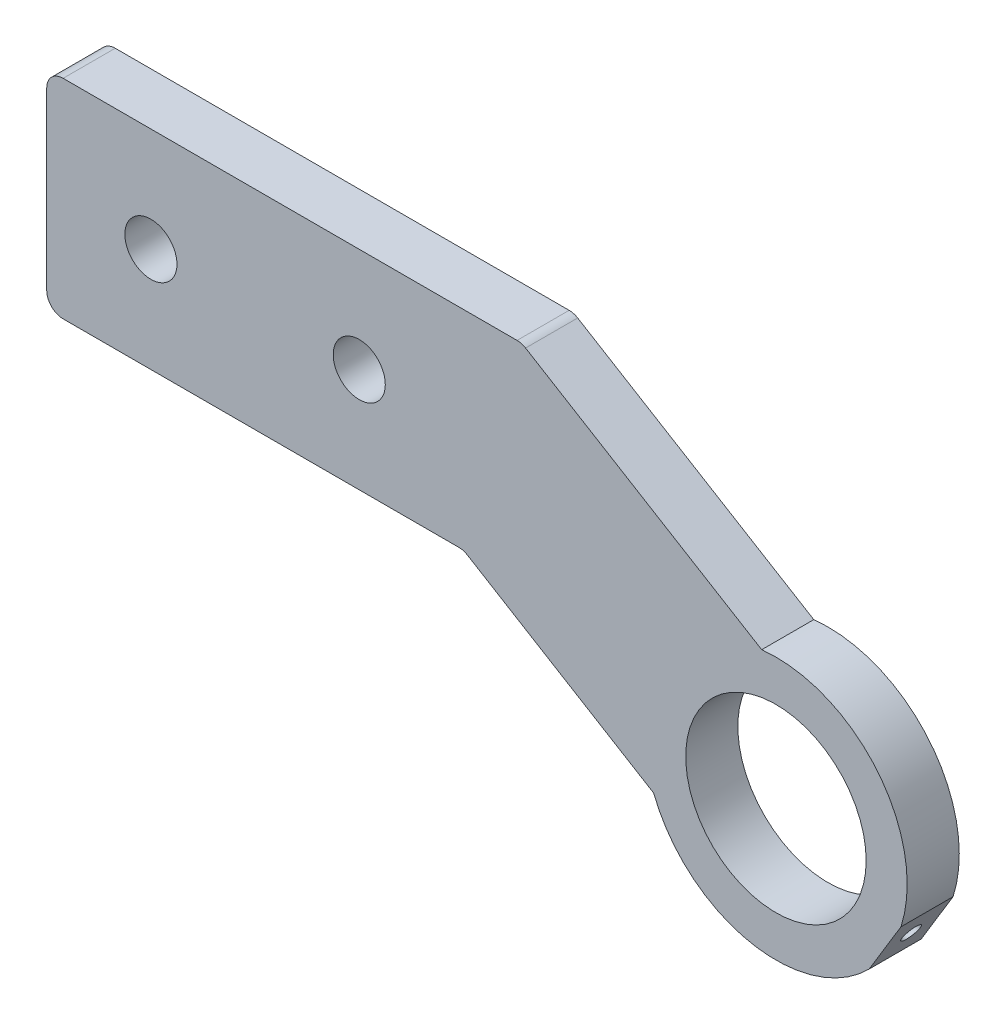
ISO-10303-21;
HEADER;
FILE_DESCRIPTION(('STEP AP214'),'2;1');
FILE_NAME('part.step','',(''),(''),'','','');
FILE_SCHEMA(('AUTOMOTIVE_DESIGN { 1 0 10303 214 1 1 1 1 }'));
ENDSEC;
DATA;
#1=APPLICATION_CONTEXT('core data for automotive mechanical design processes');
#2=APPLICATION_PROTOCOL_DEFINITION('international standard','automotive_design',2000,#1);
#3=PRODUCT_CONTEXT('',#1,'mechanical');
#4=PRODUCT('Part','Part','',(#3));
#5=PRODUCT_RELATED_PRODUCT_CATEGORY('part','',(#4));
#6=PRODUCT_DEFINITION_FORMATION('','',#4);
#7=PRODUCT_DEFINITION_CONTEXT('part definition',#1,'design');
#8=PRODUCT_DEFINITION('design','',#6,#7);
#9=PRODUCT_DEFINITION_SHAPE('','',#8);
#10=(LENGTH_UNIT() NAMED_UNIT(*) SI_UNIT(.MILLI.,.METRE.));
#11=(NAMED_UNIT(*) PLANE_ANGLE_UNIT() SI_UNIT($,.RADIAN.));
#12=(NAMED_UNIT(*) SI_UNIT($,.STERADIAN.) SOLID_ANGLE_UNIT());
#13=UNCERTAINTY_MEASURE_WITH_UNIT(LENGTH_MEASURE(1.E-05),#10,'distance_accuracy_value','');
#14=(GEOMETRIC_REPRESENTATION_CONTEXT(3) GLOBAL_UNCERTAINTY_ASSIGNED_CONTEXT((#13)) GLOBAL_UNIT_ASSIGNED_CONTEXT((#10,
#11,#12)) REPRESENTATION_CONTEXT('',''));
#15=CARTESIAN_POINT('',(0.,0.,0.));
#16=DIRECTION('',(0.,0.,1.));
#17=DIRECTION('',(1.,0.,0.));
#18=AXIS2_PLACEMENT_3D('',#15,#16,#17);
#19=CARTESIAN_POINT('',(50.8,-20.95,6.35));
#20=DIRECTION('',(0.,0.,-1.));
#21=DIRECTION('',(-1.,0.,0.));
#22=AXIS2_PLACEMENT_3D('',#19,#20,#21);
#23=PLANE('',#22);
#24=DIRECTION('',(-0.855084093292463,0.518489337786426,0.));
#25=VECTOR('',#24,1.);
#26=CARTESIAN_POINT('',(19.7992087244958,12.7,6.35));
#27=LINE('',#26,#25);
#28=CARTESIAN_POINT('',(49.0632163255362,-5.04454236847881,6.35));
#29=VERTEX_POINT('',#28);
#30=CARTESIAN_POINT('',(20.2771945871162,12.4101681865849,6.35));
#31=VERTEX_POINT('',#30);
#32=EDGE_CURVE('E155',#29,#31,#27,.T.);
#33=ORIENTED_EDGE('',*,*,#32,.T.);
#34=CARTESIAN_POINT('',(19.2402159115434,10.7,6.35));
#35=DIRECTION('',(0.,0.,-1.));
#36=DIRECTION('',(-1.,0.,0.));
#37=AXIS2_PLACEMENT_3D('',#34,#35,#36);
#38=CIRCLE('',#37,2.);
#39=CARTESIAN_POINT('',(19.2402159115434,12.7,6.35));
#40=VERTEX_POINT('',#39);
#41=EDGE_CURVE('E202',#31,#40,#38,.F.);
#42=ORIENTED_EDGE('',*,*,#41,.T.);
#43=DIRECTION('',(-1.,0.,0.));
#44=VECTOR('',#43,1.);
#45=CARTESIAN_POINT('',(19.7992087244958,12.7,6.35));
#46=LINE('',#45,#44);
#47=CARTESIAN_POINT('',(-36.1,12.7,6.35));
#48=VERTEX_POINT('',#47);
#49=EDGE_CURVE('E157',#40,#48,#46,.T.);
#50=ORIENTED_EDGE('',*,*,#49,.T.);
#51=CARTESIAN_POINT('',(-36.1,10.7,6.35));
#52=DIRECTION('',(0.,0.,-1.));
#53=DIRECTION('',(-1.,0.,0.));
#54=AXIS2_PLACEMENT_3D('',#51,#52,#53);
#55=CIRCLE('',#54,2.);
#56=CARTESIAN_POINT('',(-38.1,10.7,6.35));
#57=VERTEX_POINT('',#56);
#58=EDGE_CURVE('E55',#48,#57,#55,.F.);
#59=ORIENTED_EDGE('',*,*,#58,.T.);
#60=DIRECTION('',(0.,-1.,0.));
#61=VECTOR('',#60,1.);
#62=CARTESIAN_POINT('',(-38.1,-12.7,6.35));
#63=LINE('',#62,#61);
#64=CARTESIAN_POINT('',(-38.1,-10.7,6.35));
#65=VERTEX_POINT('',#64);
#66=EDGE_CURVE('E159',#57,#65,#63,.T.);
#67=ORIENTED_EDGE('',*,*,#66,.T.);
#68=CARTESIAN_POINT('',(-36.1,-10.7,6.35));
#69=DIRECTION('',(0.,0.,-1.));
#70=DIRECTION('',(-1.,0.,0.));
#71=AXIS2_PLACEMENT_3D('',#68,#69,#70);
#72=CIRCLE('',#71,2.);
#73=CARTESIAN_POINT('',(-36.1,-12.7,6.35));
#74=VERTEX_POINT('',#73);
#75=EDGE_CURVE('E200',#65,#74,#72,.F.);
#76=ORIENTED_EDGE('',*,*,#75,.T.);
#77=DIRECTION('',(1.,0.,0.));
#78=VECTOR('',#77,1.);
#79=CARTESIAN_POINT('',(12.7,-12.7,6.35));
#80=LINE('',#79,#78);
#81=CARTESIAN_POINT('',(12.1410071870476,-12.7,6.35));
#82=VERTEX_POINT('',#81);
#83=EDGE_CURVE('E133',#74,#82,#80,.T.);
#84=ORIENTED_EDGE('',*,*,#83,.T.);
#85=CARTESIAN_POINT('',(12.1410071870476,-14.7,6.35));
#86=DIRECTION('',(0.,0.,-1.));
#87=DIRECTION('',(-1.,0.,0.));
#88=AXIS2_PLACEMENT_3D('',#85,#86,#87);
#89=CIRCLE('',#88,2.);
#90=CARTESIAN_POINT('',(13.1779858626204,-12.9898318134151,6.35));
#91=VERTEX_POINT('',#90);
#92=EDGE_CURVE('E11',#82,#91,#89,.T.);
#93=ORIENTED_EDGE('',*,*,#92,.T.);
#94=DIRECTION('',(0.855084093292463,-0.518489337786426,0.));
#95=VECTOR('',#94,1.);
#96=CARTESIAN_POINT('',(12.7,-12.7,6.35));
#97=LINE('',#96,#95);
#98=CARTESIAN_POINT('',(35.893587145761,-26.7636783381074,6.35));
#99=VERTEX_POINT('',#98);
#100=EDGE_CURVE('E121',#91,#99,#97,.T.);
#101=ORIENTED_EDGE('',*,*,#100,.T.);
#102=CARTESIAN_POINT('',(50.8,-20.95,6.35));
#103=DIRECTION('',(0.,0.,1.));
#104=DIRECTION('',(-1.,0.,0.));
#105=AXIS2_PLACEMENT_3D('',#102,#103,#104);
#106=CIRCLE('',#105,16.);
#107=CARTESIAN_POINT('',(62.1559338958914,-32.2213249155609,6.35));
#108=VERTEX_POINT('',#107);
#109=EDGE_CURVE('E126',#99,#108,#106,.T.);
#110=ORIENTED_EDGE('',*,*,#109,.T.);
#111=DIRECTION('',(0.518489337786426,0.855084093292463,0.));
#112=VECTOR('',#111,1.);
#113=CARTESIAN_POINT('',(66.0446039292896,-25.8081942158675,6.35));
#114=LINE('',#113,#112);
#115=CARTESIAN_POINT('',(66.0446039292896,-25.8081942158675,6.35));
#116=VERTEX_POINT('',#115);
#117=EDGE_CURVE('E148',#108,#116,#114,.T.);
#118=ORIENTED_EDGE('',*,*,#117,.T.);
#119=CARTESIAN_POINT('',(50.8,-20.95,6.35));
#120=DIRECTION('',(0.,0.,1.));
#121=DIRECTION('',(-1.,0.,0.));
#122=AXIS2_PLACEMENT_3D('',#119,#120,#121);
#123=CIRCLE('',#122,16.);
#124=EDGE_CURVE('E150',#116,#29,#123,.T.);
#125=ORIENTED_EDGE('',*,*,#124,.T.);
#126=EDGE_LOOP('',(#33,#42,#50,#59,#67,#76,#84,#93,#101,#110,#118,#125));
#127=FACE_BOUND('',#126,.T.);
#128=CARTESIAN_POINT('',(50.8,-20.95,6.35));
#129=DIRECTION('',(0.,0.,1.));
#130=DIRECTION('',(1.,0.,0.));
#131=AXIS2_PLACEMENT_3D('',#128,#129,#130);
#132=CIRCLE('',#131,11.);
#133=CARTESIAN_POINT('',(61.8,-20.95,6.35));
#134=VERTEX_POINT('',#133);
#135=EDGE_CURVE('E165',#134,#134,#132,.T.);
#136=ORIENTED_EDGE('',*,*,#135,.F.);
#137=EDGE_LOOP('',(#136));
#138=FACE_BOUND('',#137,.T.);
#139=CARTESIAN_POINT('',(-25.4,0.,6.35));
#140=DIRECTION('',(0.,0.,1.));
#141=DIRECTION('',(1.,0.,0.));
#142=AXIS2_PLACEMENT_3D('',#139,#140,#141);
#143=CIRCLE('',#142,3.175);
#144=CARTESIAN_POINT('',(-22.225,0.,6.35));
#145=VERTEX_POINT('',#144);
#146=EDGE_CURVE('E382',#145,#145,#143,.T.);
#147=ORIENTED_EDGE('',*,*,#146,.F.);
#148=EDGE_LOOP('',(#147));
#149=FACE_BOUND('',#148,.T.);
#150=CARTESIAN_POINT('',(0.,0.,6.35));
#151=DIRECTION('',(0.,0.,1.));
#152=DIRECTION('',(1.,0.,0.));
#153=AXIS2_PLACEMENT_3D('',#150,#151,#152);
#154=CIRCLE('',#153,3.175);
#155=CARTESIAN_POINT('',(3.175,0.,6.35));
#156=VERTEX_POINT('',#155);
#157=EDGE_CURVE('E375',#156,#156,#154,.T.);
#158=ORIENTED_EDGE('',*,*,#157,.F.);
#159=EDGE_LOOP('',(#158));
#160=FACE_BOUND('',#159,.T.);
#161=ADVANCED_FACE('F33',(#127,#138,#149,#160),#23,.F.);
#162=CARTESIAN_POINT('',(50.8,-20.95,0.));
#163=DIRECTION('',(0.,0.,-1.));
#164=DIRECTION('',(-1.,0.,0.));
#165=AXIS2_PLACEMENT_3D('',#162,#163,#164);
#166=PLANE('',#165);
#167=CARTESIAN_POINT('',(-25.4,0.,0.));
#168=DIRECTION('',(0.,0.,1.));
#169=DIRECTION('',(1.,0.,0.));
#170=AXIS2_PLACEMENT_3D('',#167,#168,#169);
#171=CIRCLE('',#170,3.175);
#172=CARTESIAN_POINT('',(-22.225,0.,0.));
#173=VERTEX_POINT('',#172);
#174=EDGE_CURVE('E378',#173,#173,#171,.T.);
#175=ORIENTED_EDGE('',*,*,#174,.T.);
#176=EDGE_LOOP('',(#175));
#177=FACE_BOUND('',#176,.T.);
#178=DIRECTION('',(-1.,0.,0.));
#179=VECTOR('',#178,1.);
#180=CARTESIAN_POINT('',(19.7992087244958,12.7,0.));
#181=LINE('',#180,#179);
#182=CARTESIAN_POINT('',(19.2402159115434,12.7,0.));
#183=VERTEX_POINT('',#182);
#184=CARTESIAN_POINT('',(-36.1,12.7,0.));
#185=VERTEX_POINT('',#184);
#186=EDGE_CURVE('E176',#183,#185,#181,.T.);
#187=ORIENTED_EDGE('',*,*,#186,.F.);
#188=CARTESIAN_POINT('',(19.2402159115434,10.7,0.));
#189=DIRECTION('',(0.,0.,-1.));
#190=DIRECTION('',(-1.,0.,0.));
#191=AXIS2_PLACEMENT_3D('',#188,#189,#190);
#192=CIRCLE('',#191,2.);
#193=CARTESIAN_POINT('',(20.2771945871162,12.4101681865849,0.));
#194=VERTEX_POINT('',#193);
#195=EDGE_CURVE('E195',#183,#194,#192,.T.);
#196=ORIENTED_EDGE('',*,*,#195,.T.);
#197=DIRECTION('',(-0.855084093292463,0.518489337786426,0.));
#198=VECTOR('',#197,1.);
#199=CARTESIAN_POINT('',(19.7992087244958,12.7,0.));
#200=LINE('',#199,#198);
#201=CARTESIAN_POINT('',(49.0632163255362,-5.04454236847881,0.));
#202=VERTEX_POINT('',#201);
#203=EDGE_CURVE('E173',#202,#194,#200,.T.);
#204=ORIENTED_EDGE('',*,*,#203,.F.);
#205=CARTESIAN_POINT('',(50.8,-20.95,0.));
#206=DIRECTION('',(0.,0.,1.));
#207=DIRECTION('',(-1.,0.,0.));
#208=AXIS2_PLACEMENT_3D('',#205,#206,#207);
#209=CIRCLE('',#208,16.);
#210=CARTESIAN_POINT('',(66.0446039292896,-25.8081942158675,0.));
#211=VERTEX_POINT('',#210);
#212=EDGE_CURVE('E171',#211,#202,#209,.T.);
#213=ORIENTED_EDGE('',*,*,#212,.F.);
#214=DIRECTION('',(0.518489337786426,0.855084093292463,0.));
#215=VECTOR('',#214,1.);
#216=CARTESIAN_POINT('',(66.0446039292896,-25.8081942158675,0.));
#217=LINE('',#216,#215);
#218=CARTESIAN_POINT('',(62.1559338958914,-32.2213249155609,0.));
#219=VERTEX_POINT('',#218);
#220=EDGE_CURVE('E169',#219,#211,#217,.T.);
#221=ORIENTED_EDGE('',*,*,#220,.F.);
#222=CARTESIAN_POINT('',(50.8,-20.95,0.));
#223=DIRECTION('',(0.,0.,1.));
#224=DIRECTION('',(-1.,0.,0.));
#225=AXIS2_PLACEMENT_3D('',#222,#223,#224);
#226=CIRCLE('',#225,16.);
#227=CARTESIAN_POINT('',(35.893587145761,-26.7636783381074,0.));
#228=VERTEX_POINT('',#227);
#229=EDGE_CURVE('E167',#228,#219,#226,.T.);
#230=ORIENTED_EDGE('',*,*,#229,.F.);
#231=DIRECTION('',(0.855084093292463,-0.518489337786426,0.));
#232=VECTOR('',#231,1.);
#233=CARTESIAN_POINT('',(12.7,-12.7,0.));
#234=LINE('',#233,#232);
#235=CARTESIAN_POINT('',(13.1779858626204,-12.9898318134151,0.));
#236=VERTEX_POINT('',#235);
#237=EDGE_CURVE('E139',#236,#228,#234,.T.);
#238=ORIENTED_EDGE('',*,*,#237,.F.);
#239=CARTESIAN_POINT('',(12.1410071870476,-14.7,0.));
#240=DIRECTION('',(0.,0.,-1.));
#241=DIRECTION('',(-1.,0.,0.));
#242=AXIS2_PLACEMENT_3D('',#239,#240,#241);
#243=CIRCLE('',#242,2.);
#244=CARTESIAN_POINT('',(12.1410071870476,-12.7,0.));
#245=VERTEX_POINT('',#244);
#246=EDGE_CURVE('E41',#236,#245,#243,.F.);
#247=ORIENTED_EDGE('',*,*,#246,.T.);
#248=DIRECTION('',(1.,0.,0.));
#249=VECTOR('',#248,1.);
#250=CARTESIAN_POINT('',(12.7,-12.7,0.));
#251=LINE('',#250,#249);
#252=CARTESIAN_POINT('',(-36.1,-12.7,0.));
#253=VERTEX_POINT('',#252);
#254=EDGE_CURVE('E162',#253,#245,#251,.T.);
#255=ORIENTED_EDGE('',*,*,#254,.F.);
#256=CARTESIAN_POINT('',(-36.1,-10.7,0.));
#257=DIRECTION('',(0.,0.,-1.));
#258=DIRECTION('',(-1.,0.,0.));
#259=AXIS2_PLACEMENT_3D('',#256,#257,#258);
#260=CIRCLE('',#259,2.);
#261=CARTESIAN_POINT('',(-38.1,-10.7,0.));
#262=VERTEX_POINT('',#261);
#263=EDGE_CURVE('E193',#253,#262,#260,.T.);
#264=ORIENTED_EDGE('',*,*,#263,.T.);
#265=DIRECTION('',(0.,-1.,0.));
#266=VECTOR('',#265,1.);
#267=CARTESIAN_POINT('',(-38.1,-12.7,0.));
#268=LINE('',#267,#266);
#269=CARTESIAN_POINT('',(-38.1,10.7,0.));
#270=VERTEX_POINT('',#269);
#271=EDGE_CURVE('E179',#270,#262,#268,.T.);
#272=ORIENTED_EDGE('',*,*,#271,.F.);
#273=CARTESIAN_POINT('',(-36.1,10.7,0.));
#274=DIRECTION('',(0.,0.,-1.));
#275=DIRECTION('',(-1.,0.,0.));
#276=AXIS2_PLACEMENT_3D('',#273,#274,#275);
#277=CIRCLE('',#276,2.);
#278=EDGE_CURVE('E191',#270,#185,#277,.T.);
#279=ORIENTED_EDGE('',*,*,#278,.T.);
#280=EDGE_LOOP('',(#187,#196,#204,#213,#221,#230,#238,#247,#255,#264,#272,#279));
#281=FACE_BOUND('',#280,.T.);
#282=CARTESIAN_POINT('',(50.8,-20.95,0.));
#283=DIRECTION('',(0.,0.,1.));
#284=DIRECTION('',(1.,0.,0.));
#285=AXIS2_PLACEMENT_3D('',#282,#283,#284);
#286=CIRCLE('',#285,11.);
#287=CARTESIAN_POINT('',(61.8,-20.95,0.));
#288=VERTEX_POINT('',#287);
#289=EDGE_CURVE('E385',#288,#288,#286,.T.);
#290=ORIENTED_EDGE('',*,*,#289,.T.);
#291=EDGE_LOOP('',(#290));
#292=FACE_BOUND('',#291,.T.);
#293=CARTESIAN_POINT('',(0.,0.,0.));
#294=DIRECTION('',(0.,0.,1.));
#295=DIRECTION('',(1.,0.,0.));
#296=AXIS2_PLACEMENT_3D('',#293,#294,#295);
#297=CIRCLE('',#296,3.175);
#298=CARTESIAN_POINT('',(3.175,0.,0.));
#299=VERTEX_POINT('',#298);
#300=EDGE_CURVE('E379',#299,#299,#297,.T.);
#301=ORIENTED_EDGE('',*,*,#300,.T.);
#302=EDGE_LOOP('',(#301));
#303=FACE_BOUND('',#302,.T.);
#304=ADVANCED_FACE('F217',(#177,#281,#292,#303),#166,.T.);
#305=CARTESIAN_POINT('',(12.7,-12.7,6.35));
#306=DIRECTION('',(0.,1.,0.));
#307=DIRECTION('',(-1.,0.,0.));
#308=AXIS2_PLACEMENT_3D('',#305,#306,#307);
#309=PLANE('',#308);
#310=ORIENTED_EDGE('',*,*,#254,.T.);
#311=DIRECTION('',(0.,0.,-1.));
#312=VECTOR('',#311,1.);
#313=CARTESIAN_POINT('',(12.1410071870476,-12.7,6.35));
#314=LINE('',#313,#312);
#315=EDGE_CURVE('E209',#245,#82,#314,.F.);
#316=ORIENTED_EDGE('',*,*,#315,.T.);
#317=ORIENTED_EDGE('',*,*,#83,.F.);
#318=DIRECTION('',(0.,0.,-1.));
#319=VECTOR('',#318,1.);
#320=CARTESIAN_POINT('',(-36.1,-12.7,6.35));
#321=LINE('',#320,#319);
#322=EDGE_CURVE('E206',#74,#253,#321,.T.);
#323=ORIENTED_EDGE('',*,*,#322,.T.);
#324=EDGE_LOOP('',(#310,#316,#317,#323));
#325=FACE_BOUND('',#324,.T.);
#326=ADVANCED_FACE('F222',(#325),#309,.F.);
#327=CARTESIAN_POINT('',(12.7,-12.7,6.35));
#328=DIRECTION('',(0.518489337786426,0.855084093292463,0.));
#329=DIRECTION('',(-0.855084093292463,0.518489337786426,0.));
#330=AXIS2_PLACEMENT_3D('',#327,#328,#329);
#331=PLANE('',#330);
#332=ORIENTED_EDGE('',*,*,#100,.F.);
#333=DIRECTION('',(0.,0.,-1.));
#334=VECTOR('',#333,1.);
#335=CARTESIAN_POINT('',(13.1779858626204,-12.9898318134151,0.));
#336=LINE('',#335,#334);
#337=EDGE_CURVE('E204',#91,#236,#336,.T.);
#338=ORIENTED_EDGE('',*,*,#337,.T.);
#339=ORIENTED_EDGE('',*,*,#237,.T.);
#340=DIRECTION('',(0.,0.,-1.));
#341=VECTOR('',#340,1.);
#342=CARTESIAN_POINT('',(35.893587145761,-26.7636783381074,6.35));
#343=LINE('',#342,#341);
#344=EDGE_CURVE('E136',#99,#228,#343,.T.);
#345=ORIENTED_EDGE('',*,*,#344,.F.);
#346=EDGE_LOOP('',(#332,#338,#339,#345));
#347=FACE_BOUND('',#346,.T.);
#348=ADVANCED_FACE('F137',(#347),#331,.F.);
#349=CARTESIAN_POINT('',(50.8,-20.95,6.35));
#350=DIRECTION('',(0.,0.,-1.));
#351=DIRECTION('',(-1.,0.,0.));
#352=AXIS2_PLACEMENT_3D('',#349,#350,#351);
#353=CYLINDRICAL_SURFACE('',#352,16.);
#354=ORIENTED_EDGE('',*,*,#229,.T.);
#355=DIRECTION('',(0.,0.,-1.));
#356=VECTOR('',#355,1.);
#357=CARTESIAN_POINT('',(62.1559338958914,-32.2213249155609,6.35));
#358=LINE('',#357,#356);
#359=EDGE_CURVE('E143',#108,#219,#358,.T.);
#360=ORIENTED_EDGE('',*,*,#359,.F.);
#361=ORIENTED_EDGE('',*,*,#109,.F.);
#362=ORIENTED_EDGE('',*,*,#344,.T.);
#363=EDGE_LOOP('',(#354,#360,#361,#362));
#364=FACE_BOUND('',#363,.T.);
#365=ADVANCED_FACE('F145',(#364),#353,.T.);
#366=CARTESIAN_POINT('',(66.0446039292896,-25.8081942158675,6.35));
#367=DIRECTION('',(-0.855084093292463,0.518489337786426,0.));
#368=DIRECTION('',(-0.518489337786426,-0.855084093292463,0.));
#369=AXIS2_PLACEMENT_3D('',#366,#367,#368);
#370=PLANE('',#369);
#371=CARTESIAN_POINT('',(64.1002689125905,-29.0147595657142,3.175));
#372=DIRECTION('',(0.855084093292463,-0.518489337786426,0.));
#373=DIRECTION('',(0.518489337786426,0.855084093292463,0.));
#374=AXIS2_PLACEMENT_3D('',#371,#372,#373);
#375=CIRCLE('',#374,1.1303);
#376=CARTESIAN_POINT('',(64.6863174110905,-28.0482580150657,3.175));
#377=VERTEX_POINT('',#376);
#378=EDGE_CURVE('E374',#377,#377,#375,.T.);
#379=ORIENTED_EDGE('',*,*,#378,.F.);
#380=EDGE_LOOP('',(#379));
#381=FACE_BOUND('',#380,.T.);
#382=ORIENTED_EDGE('',*,*,#220,.T.);
#383=DIRECTION('',(0.,0.,-1.));
#384=VECTOR('',#383,1.);
#385=CARTESIAN_POINT('',(66.0446039292896,-25.8081942158675,6.35));
#386=LINE('',#385,#384);
#387=EDGE_CURVE('E183',#116,#211,#386,.T.);
#388=ORIENTED_EDGE('',*,*,#387,.F.);
#389=ORIENTED_EDGE('',*,*,#117,.F.);
#390=ORIENTED_EDGE('',*,*,#359,.T.);
#391=EDGE_LOOP('',(#382,#388,#389,#390));
#392=FACE_BOUND('',#391,.T.);
#393=ADVANCED_FACE('F263',(#381,#392),#370,.F.);
#394=CARTESIAN_POINT('',(50.8,-20.95,6.35));
#395=DIRECTION('',(0.,0.,-1.));
#396=DIRECTION('',(-1.,0.,0.));
#397=AXIS2_PLACEMENT_3D('',#394,#395,#396);
#398=CYLINDRICAL_SURFACE('',#397,16.);
#399=ORIENTED_EDGE('',*,*,#212,.T.);
#400=DIRECTION('',(0.,0.,-1.));
#401=VECTOR('',#400,1.);
#402=CARTESIAN_POINT('',(49.0632163255362,-5.04454236847881,6.35));
#403=LINE('',#402,#401);
#404=EDGE_CURVE('E161',#29,#202,#403,.T.);
#405=ORIENTED_EDGE('',*,*,#404,.F.);
#406=ORIENTED_EDGE('',*,*,#124,.F.);
#407=ORIENTED_EDGE('',*,*,#387,.T.);
#408=EDGE_LOOP('',(#399,#405,#406,#407));
#409=FACE_BOUND('',#408,.T.);
#410=ADVANCED_FACE('F259',(#409),#398,.T.);
#411=CARTESIAN_POINT('',(19.7992087244958,12.7,6.35));
#412=DIRECTION('',(-0.518489337786426,-0.855084093292463,0.));
#413=DIRECTION('',(0.855084093292463,-0.518489337786426,0.));
#414=AXIS2_PLACEMENT_3D('',#411,#412,#413);
#415=PLANE('',#414);
#416=ORIENTED_EDGE('',*,*,#203,.T.);
#417=DIRECTION('',(0.,0.,-1.));
#418=VECTOR('',#417,1.);
#419=CARTESIAN_POINT('',(20.2771945871162,12.4101681865849,6.35));
#420=LINE('',#419,#418);
#421=EDGE_CURVE('E197',#194,#31,#420,.F.);
#422=ORIENTED_EDGE('',*,*,#421,.T.);
#423=ORIENTED_EDGE('',*,*,#32,.F.);
#424=ORIENTED_EDGE('',*,*,#404,.T.);
#425=EDGE_LOOP('',(#416,#422,#423,#424));
#426=FACE_BOUND('',#425,.T.);
#427=ADVANCED_FACE('F255',(#426),#415,.F.);
#428=CARTESIAN_POINT('',(19.7992087244958,12.7,6.35));
#429=DIRECTION('',(0.,-1.,0.));
#430=DIRECTION('',(1.,0.,0.));
#431=AXIS2_PLACEMENT_3D('',#428,#429,#430);
#432=PLANE('',#431);
#433=ORIENTED_EDGE('',*,*,#49,.F.);
#434=DIRECTION('',(0.,0.,-1.));
#435=VECTOR('',#434,1.);
#436=CARTESIAN_POINT('',(19.2402159115434,12.7,6.35));
#437=LINE('',#436,#435);
#438=EDGE_CURVE('E188',#40,#183,#437,.T.);
#439=ORIENTED_EDGE('',*,*,#438,.T.);
#440=ORIENTED_EDGE('',*,*,#186,.T.);
#441=DIRECTION('',(0.,0.,-1.));
#442=VECTOR('',#441,1.);
#443=CARTESIAN_POINT('',(-36.1,12.7,6.35));
#444=LINE('',#443,#442);
#445=EDGE_CURVE('E142',#185,#48,#444,.F.);
#446=ORIENTED_EDGE('',*,*,#445,.T.);
#447=EDGE_LOOP('',(#433,#439,#440,#446));
#448=FACE_BOUND('',#447,.T.);
#449=ADVANCED_FACE('F252',(#448),#432,.F.);
#450=CARTESIAN_POINT('',(-38.1,-12.7,6.35));
#451=DIRECTION('',(1.,0.,0.));
#452=DIRECTION('',(0.,0.,-1.));
#453=AXIS2_PLACEMENT_3D('',#450,#451,#452);
#454=PLANE('',#453);
#455=ORIENTED_EDGE('',*,*,#271,.T.);
#456=DIRECTION('',(0.,0.,-1.));
#457=VECTOR('',#456,1.);
#458=CARTESIAN_POINT('',(-38.1,-10.7,6.35));
#459=LINE('',#458,#457);
#460=EDGE_CURVE('E48',#262,#65,#459,.F.);
#461=ORIENTED_EDGE('',*,*,#460,.T.);
#462=ORIENTED_EDGE('',*,*,#66,.F.);
#463=DIRECTION('',(0.,0.,-1.));
#464=VECTOR('',#463,1.);
#465=CARTESIAN_POINT('',(-38.1,10.7,6.35));
#466=LINE('',#465,#464);
#467=EDGE_CURVE('E211',#57,#270,#466,.T.);
#468=ORIENTED_EDGE('',*,*,#467,.T.);
#469=EDGE_LOOP('',(#455,#461,#462,#468));
#470=FACE_BOUND('',#469,.T.);
#471=ADVANCED_FACE('F249',(#470),#454,.F.);
#472=CARTESIAN_POINT('',(50.8,-20.95,6.35));
#473=DIRECTION('',(0.,0.,-1.));
#474=DIRECTION('',(-1.,0.,0.));
#475=AXIS2_PLACEMENT_3D('',#472,#473,#474);
#476=CYLINDRICAL_SURFACE('',#475,11.);
#477=CARTESIAN_POINT('',(60.7421855406457,-25.6566916911325,3.175));
#478=CARTESIAN_POINT('',(60.7421847722216,-25.6566944269906,3.2383093752718));
#479=CARTESIAN_POINT('',(60.7398932857835,-25.6615432044217,3.30166038361784));
#480=CARTESIAN_POINT('',(60.7307476425883,-25.6807885587255,3.42660531194275));
#481=CARTESIAN_POINT('',(60.7238884834253,-25.6951956035195,3.48819722819421));
#482=CARTESIAN_POINT('',(60.7056929808326,-25.7330623146684,3.60779652771831));
#483=CARTESIAN_POINT('',(60.6943593837912,-25.7565164277744,3.66580608461529));
#484=CARTESIAN_POINT('',(60.6673644005523,-25.8116929759156,3.77663704104919));
#485=CARTESIAN_POINT('',(60.6517038619199,-25.8434137915929,3.82945945390463));
#486=CARTESIAN_POINT('',(60.6162153258096,-25.9142205499615,3.92863141639375));
#487=CARTESIAN_POINT('',(60.5963733052074,-25.9533312286581,3.97495828911293));
#488=CARTESIAN_POINT('',(60.5528713981434,-26.0376068611052,4.05962878623405));
#489=CARTESIAN_POINT('',(60.5292113356148,-26.0827720940415,4.09797204228949));
#490=CARTESIAN_POINT('',(60.4784501539972,-26.1778589436466,4.1656656002267));
#491=CARTESIAN_POINT('',(60.4513415240713,-26.2277908809134,4.19499578092146));
#492=CARTESIAN_POINT('',(60.3942954536691,-26.3307952036498,4.24370187188756));
#493=CARTESIAN_POINT('',(60.3643580857336,-26.383867508574,4.26307803733964));
#494=CARTESIAN_POINT('',(60.3024800453182,-26.491362955833,4.29125942951325));
#495=CARTESIAN_POINT('',(60.2705468650886,-26.54578063133,4.30010195410387));
#496=CARTESIAN_POINT('',(60.2054290739639,-26.6545526535063,4.30708048247749));
#497=CARTESIAN_POINT('',(60.1722444972128,-26.7089070018718,4.30521677816713));
#498=CARTESIAN_POINT('',(60.1057136500006,-26.8158028653165,4.29086599133595));
#499=CARTESIAN_POINT('',(60.0723684619577,-26.8683504462751,4.27841901600467));
#500=CARTESIAN_POINT('',(60.0064254061933,-26.9704173787112,4.24331751404936));
#501=CARTESIAN_POINT('',(59.9738275486486,-27.0199366889665,4.22066284850919));
#502=CARTESIAN_POINT('',(59.9103910561834,-27.1147414856166,4.16574520550611));
#503=CARTESIAN_POINT('',(59.879555789597,-27.1600189647736,4.13346451902435));
#504=CARTESIAN_POINT('',(59.8207755171047,-27.245100250556,4.06022402544102));
#505=CARTESIAN_POINT('',(59.7928306007713,-27.2849038875585,4.01926394948316));
#506=CARTESIAN_POINT('',(59.7407206839725,-27.3582408735815,3.92960191144448));
#507=CARTESIAN_POINT('',(59.7165737447462,-27.3917444017219,3.8808650532729));
#508=CARTESIAN_POINT('',(59.6731342894381,-27.4514502604216,3.77715378876324));
#509=CARTESIAN_POINT('',(59.6538417810589,-27.4776525793958,3.722179372528));
#510=CARTESIAN_POINT('',(59.6208697890934,-27.5221402019331,3.60752629688005));
#511=CARTESIAN_POINT('',(59.6071915911622,-27.5404236921682,3.5478465636938));
#512=CARTESIAN_POINT('',(59.5860145304009,-27.5686299594266,3.42549046929809));
#513=CARTESIAN_POINT('',(59.5785154685605,-27.5785530057134,3.36281420466613));
#514=CARTESIAN_POINT('',(59.5700293564084,-27.5897767504576,3.2365504478728));
#515=CARTESIAN_POINT('',(59.5690127405562,-27.5911165958385,3.17296842031964));
#516=CARTESIAN_POINT('',(59.5734553108331,-27.5852464104059,3.04642920924612));
#517=CARTESIAN_POINT('',(59.5789144044816,-27.5780365016929,2.98347201681534));
#518=CARTESIAN_POINT('',(59.596061358768,-27.5552634243568,2.86011225084132));
#519=CARTESIAN_POINT('',(59.6077353283294,-27.5397188841947,2.79970430311385));
#520=CARTESIAN_POINT('',(59.6368282935195,-27.5006530511608,2.68299062780025));
#521=CARTESIAN_POINT('',(59.6542474278547,-27.4771315656999,2.62668499929713));
#522=CARTESIAN_POINT('',(59.6942152930527,-27.4225634702725,2.51955198879852));
#523=CARTESIAN_POINT('',(59.7167822336993,-27.3914901202811,2.46874502175224));
#524=CARTESIAN_POINT('',(59.7661467999623,-27.3225977980833,2.37425870601754));
#525=CARTESIAN_POINT('',(59.792944536213,-27.2847786494726,2.33057954378007));
#526=CARTESIAN_POINT('',(59.8498945018874,-27.2031504671346,2.25142011830135));
#527=CARTESIAN_POINT('',(59.8800591186765,-27.1593191686326,2.2159717153932));
#528=CARTESIAN_POINT('',(59.9425885357086,-27.066877019389,2.15449941990833));
#529=CARTESIAN_POINT('',(59.9749533043385,-27.0182662373172,2.12847539195079));
#530=CARTESIAN_POINT('',(60.0407252018615,-26.9176294576661,2.0866444211739));
#531=CARTESIAN_POINT('',(60.0741302516416,-26.8656100682203,2.07081831800913));
#532=CARTESIAN_POINT('',(60.1409725847966,-26.7594889245023,2.04976992835101));
#533=CARTESIAN_POINT('',(60.1744098671818,-26.7053872323034,2.04454732601679));
#534=CARTESIAN_POINT('',(60.2401663605815,-26.5968810267548,2.04485877245698));
#535=CARTESIAN_POINT('',(60.2724900114455,-26.5424790553788,2.05034339492369));
#536=CARTESIAN_POINT('',(60.3353022490352,-26.4346971814868,2.07180985561379));
#537=CARTESIAN_POINT('',(60.3657908345457,-26.3813172796474,2.08779170078789));
#538=CARTESIAN_POINT('',(60.4241818583206,-26.2771653292599,2.12978505825631));
#539=CARTESIAN_POINT('',(60.45208469302,-26.2263928814831,2.1557950299199));
#540=CARTESIAN_POINT('',(60.5047050449474,-26.1289737329372,2.2171010726687));
#541=CARTESIAN_POINT('',(60.5294225750905,-26.0823270154404,2.25239710610122));
#542=CARTESIAN_POINT('',(60.5753056435877,-25.9943903925834,2.33145849804621));
#543=CARTESIAN_POINT('',(60.5964549678715,-25.953125123649,2.37526066929072));
#544=CARTESIAN_POINT('',(60.6347182485042,-25.8774860434162,2.47001777672048));
#545=CARTESIAN_POINT('',(60.6518312366875,-25.8431138858123,2.52097442432999));
#546=CARTESIAN_POINT('',(60.6818018458142,-25.7823025779477,2.62874382430342));
#547=CARTESIAN_POINT('',(60.6946479860291,-25.755884848066,2.68557184522136));
#548=CARTESIAN_POINT('',(60.7158384867739,-25.7120107268044,2.80332489785505));
#549=CARTESIAN_POINT('',(60.7241879074943,-25.6945442635769,2.86424523722569));
#550=CARTESIAN_POINT('',(60.7342178225049,-25.6734941056128,2.96708976205617));
#551=CARTESIAN_POINT('',(60.7372036705144,-25.6672031031962,3.00835724035597));
#552=CARTESIAN_POINT('',(60.7411877788142,-25.6588010020981,3.0914104298421));
#553=CARTESIAN_POINT('',(60.7421860480444,-25.6566898846159,3.13319613869663));
#554=CARTESIAN_POINT('',(60.7421855406457,-25.6566916911325,3.175));
#555=B_SPLINE_CURVE_WITH_KNOTS('',3,(#477,#478,#479,#480,#481,#482,#483,#484,#485,#486,#487,
#488,#489,#490,#491,#492,#493,#494,#495,#496,#497,#498,#499,#500,#501,#502,#503,#504,#505,#506,
#507,#508,#509,#510,#511,#512,#513,#514,#515,#516,#517,#518,#519,#520,#521,#522,#523,#524,#525,
#526,#527,#528,#529,#530,#531,#532,#533,#534,#535,#536,#537,#538,#539,#540,#541,#542,#543,#544,
#545,#546,#547,#548,#549,#550,#551,#552,#553,#554),.UNSPECIFIED.,.T.,.F.,(4,2,2,2,2,2,2,2,2,2,2,
2,2,2,2,2,2,2,2,2,2,2,2,2,2,2,2,2,2,2,2,2,2,2,2,2,2,2,4),(0.,0.189775460156518,0.37975910041817,
0.569626310488383,0.759456355539542,0.949933449528319,1.14041932976479,1.33132742046986,
1.52223061681837,1.71245582824659,1.90267585318592,2.0921782020632,2.28168312994969,
2.47153886434504,2.66140048064838,2.85213933097918,3.04287848396004,3.23366129112727,
3.42443795354938,3.61434388386972,3.80424710214636,3.99372763257625,4.18321273799853,
4.37337881554887,4.56354986671501,4.75444521273455,4.94533781644013,5.13587070814942,
5.32639792447271,5.51604771528226,5.70569763166799,5.89531842355669,6.08493844659157,
6.27539816791209,6.4659035270243,6.65691739963529,6.84771587144365,6.97302721221798,
7.09833798935181),.UNSPECIFIED.);
#556=CARTESIAN_POINT('',(60.7421855406457,-25.6566916911325,3.175));
#557=VERTEX_POINT('',#556);
#558=EDGE_CURVE('E367',#557,#557,#555,.T.);
#559=ORIENTED_EDGE('',*,*,#558,.T.);
#560=EDGE_LOOP('',(#559));
#561=FACE_BOUND('',#560,.T.);
#562=ORIENTED_EDGE('',*,*,#135,.T.);
#563=EDGE_LOOP('',(#562));
#564=FACE_BOUND('',#563,.T.);
#565=ORIENTED_EDGE('',*,*,#289,.F.);
#566=EDGE_LOOP('',(#565));
#567=FACE_BOUND('',#566,.T.);
#568=ADVANCED_FACE('F246',(#561,#564,#567),#476,.F.);
#569=CARTESIAN_POINT('',(-25.4,0.,6.35));
#570=DIRECTION('',(0.,0.,-1.));
#571=DIRECTION('',(-1.,0.,0.));
#572=AXIS2_PLACEMENT_3D('',#569,#570,#571);
#573=CYLINDRICAL_SURFACE('',#572,3.175);
#574=ORIENTED_EDGE('',*,*,#146,.T.);
#575=EDGE_LOOP('',(#574));
#576=FACE_BOUND('',#575,.T.);
#577=ORIENTED_EDGE('',*,*,#174,.F.);
#578=EDGE_LOOP('',(#577));
#579=FACE_BOUND('',#578,.T.);
#580=ADVANCED_FACE('F314',(#576,#579),#573,.F.);
#581=CARTESIAN_POINT('',(0.,0.,6.35));
#582=DIRECTION('',(0.,0.,-1.));
#583=DIRECTION('',(-1.,0.,0.));
#584=AXIS2_PLACEMENT_3D('',#581,#582,#583);
#585=CYLINDRICAL_SURFACE('',#584,3.175);
#586=ORIENTED_EDGE('',*,*,#157,.T.);
#587=EDGE_LOOP('',(#586));
#588=FACE_BOUND('',#587,.T.);
#589=ORIENTED_EDGE('',*,*,#300,.F.);
#590=EDGE_LOOP('',(#589));
#591=FACE_BOUND('',#590,.T.);
#592=ADVANCED_FACE('F235',(#588,#591),#585,.F.);
#593=CARTESIAN_POINT('',(19.2402159115434,10.7,6.35));
#594=DIRECTION('',(0.,0.,-1.));
#595=DIRECTION('',(-1.,0.,0.));
#596=AXIS2_PLACEMENT_3D('',#593,#594,#595);
#597=CYLINDRICAL_SURFACE('',#596,2.);
#598=ORIENTED_EDGE('',*,*,#41,.F.);
#599=ORIENTED_EDGE('',*,*,#421,.F.);
#600=ORIENTED_EDGE('',*,*,#195,.F.);
#601=ORIENTED_EDGE('',*,*,#438,.F.);
#602=EDGE_LOOP('',(#598,#599,#600,#601));
#603=FACE_BOUND('',#602,.T.);
#604=ADVANCED_FACE('F228',(#603),#597,.T.);
#605=CARTESIAN_POINT('',(12.1410071870476,-14.7,6.35));
#606=DIRECTION('',(0.,0.,1.));
#607=DIRECTION('',(1.,0.,0.));
#608=AXIS2_PLACEMENT_3D('',#605,#606,#607);
#609=CYLINDRICAL_SURFACE('',#608,2.);
#610=ORIENTED_EDGE('',*,*,#92,.F.);
#611=ORIENTED_EDGE('',*,*,#315,.F.);
#612=ORIENTED_EDGE('',*,*,#246,.F.);
#613=ORIENTED_EDGE('',*,*,#337,.F.);
#614=EDGE_LOOP('',(#610,#611,#612,#613));
#615=FACE_BOUND('',#614,.T.);
#616=ADVANCED_FACE('F225',(#615),#609,.F.);
#617=CARTESIAN_POINT('',(-36.1,-10.7,6.35));
#618=DIRECTION('',(0.,0.,-1.));
#619=DIRECTION('',(-1.,0.,0.));
#620=AXIS2_PLACEMENT_3D('',#617,#618,#619);
#621=CYLINDRICAL_SURFACE('',#620,2.);
#622=ORIENTED_EDGE('',*,*,#75,.F.);
#623=ORIENTED_EDGE('',*,*,#460,.F.);
#624=ORIENTED_EDGE('',*,*,#263,.F.);
#625=ORIENTED_EDGE('',*,*,#322,.F.);
#626=EDGE_LOOP('',(#622,#623,#624,#625));
#627=FACE_BOUND('',#626,.T.);
#628=ADVANCED_FACE('F227',(#627),#621,.T.);
#629=CARTESIAN_POINT('',(-36.1,10.7,6.35));
#630=DIRECTION('',(0.,0.,-1.));
#631=DIRECTION('',(-1.,0.,0.));
#632=AXIS2_PLACEMENT_3D('',#629,#630,#631);
#633=CYLINDRICAL_SURFACE('',#632,2.);
#634=ORIENTED_EDGE('',*,*,#58,.F.);
#635=ORIENTED_EDGE('',*,*,#445,.F.);
#636=ORIENTED_EDGE('',*,*,#278,.F.);
#637=ORIENTED_EDGE('',*,*,#467,.F.);
#638=EDGE_LOOP('',(#634,#635,#636,#637));
#639=FACE_BOUND('',#638,.T.);
#640=ADVANCED_FACE('F35',(#639),#633,.T.);
#641=CARTESIAN_POINT('',(-29.1208757324615,27.5108733326795,3.175));
#642=DIRECTION('',(0.855084093292463,-0.518489337786426,0.));
#643=DIRECTION('',(0.518489337786426,0.855084093292463,0.));
#644=AXIS2_PLACEMENT_3D('',#641,#642,#643);
#645=CYLINDRICAL_SURFACE('',#644,1.1303);
#646=ORIENTED_EDGE('',*,*,#558,.F.);
#647=EDGE_LOOP('',(#646));
#648=FACE_BOUND('',#647,.T.);
#649=ORIENTED_EDGE('',*,*,#378,.T.);
#650=EDGE_LOOP('',(#649));
#651=FACE_BOUND('',#650,.T.);
#652=ADVANCED_FACE('F348',(#648,#651),#645,.F.);
#653=CLOSED_SHELL('',(#161,#304,#326,#348,#365,#393,#410,#427,#449,#471,#568,#580,#592,#604,
#616,#628,#640,#652));
#654=MANIFOLD_SOLID_BREP('B2',#653);
#655=ADVANCED_BREP_SHAPE_REPRESENTATION('',(#18,#654),#14);
#656=SHAPE_DEFINITION_REPRESENTATION(#9,#655);
ENDSEC;
END-ISO-10303-21;
